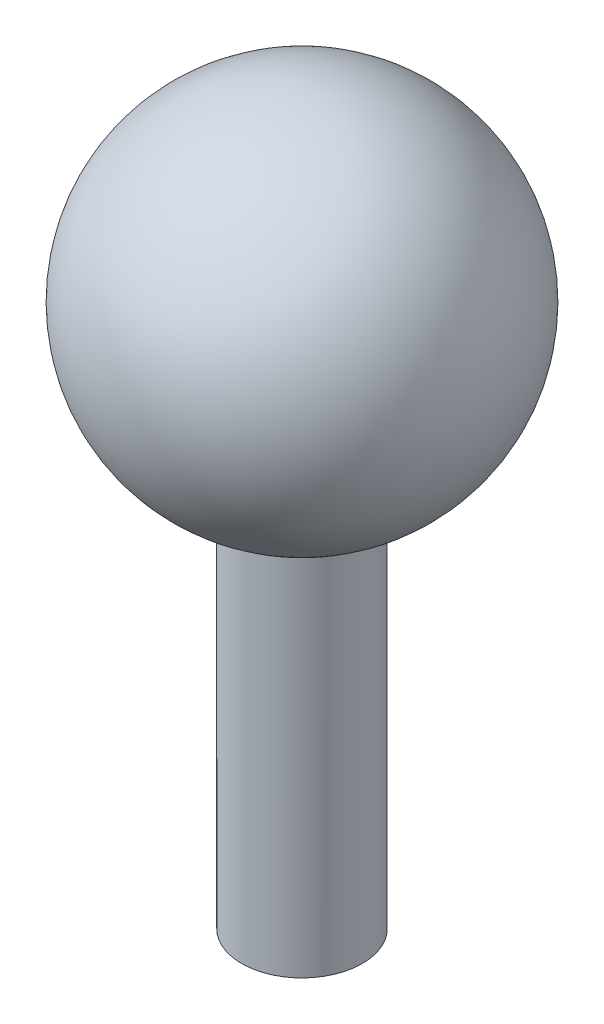
ISO-10303-21;
HEADER;
FILE_DESCRIPTION(('STEP AP214'),'2;1');
FILE_NAME('part.step','',(''),(''),'','','');
FILE_SCHEMA(('AUTOMOTIVE_DESIGN { 1 0 10303 214 1 1 1 1 }'));
ENDSEC;
DATA;
#1=APPLICATION_CONTEXT('core data for automotive mechanical design processes');
#2=APPLICATION_PROTOCOL_DEFINITION('international standard','automotive_design',2000,#1);
#3=PRODUCT_CONTEXT('',#1,'mechanical');
#4=PRODUCT('Part','Part','',(#3));
#5=PRODUCT_RELATED_PRODUCT_CATEGORY('part','',(#4));
#6=PRODUCT_DEFINITION_FORMATION('','',#4);
#7=PRODUCT_DEFINITION_CONTEXT('part definition',#1,'design');
#8=PRODUCT_DEFINITION('design','',#6,#7);
#9=PRODUCT_DEFINITION_SHAPE('','',#8);
#10=(LENGTH_UNIT() NAMED_UNIT(*) SI_UNIT(.MILLI.,.METRE.));
#11=(NAMED_UNIT(*) PLANE_ANGLE_UNIT() SI_UNIT($,.RADIAN.));
#12=(NAMED_UNIT(*) SI_UNIT($,.STERADIAN.) SOLID_ANGLE_UNIT());
#13=UNCERTAINTY_MEASURE_WITH_UNIT(LENGTH_MEASURE(1.E-05),#10,'distance_accuracy_value','');
#14=(GEOMETRIC_REPRESENTATION_CONTEXT(3) GLOBAL_UNCERTAINTY_ASSIGNED_CONTEXT((#13)) GLOBAL_UNIT_ASSIGNED_CONTEXT((#10,
#11,#12)) REPRESENTATION_CONTEXT('',''));
#15=CARTESIAN_POINT('',(0.,0.,0.));
#16=DIRECTION('',(0.,0.,1.));
#17=DIRECTION('',(1.,0.,0.));
#18=AXIS2_PLACEMENT_3D('',#15,#16,#17);
#19=CARTESIAN_POINT('',(0.,45.,0.));
#20=DIRECTION('',(0.,-1.,0.));
#21=DIRECTION('',(1.,0.,0.));
#22=AXIS2_PLACEMENT_3D('',#19,#20,#21);
#23=SPHERICAL_SURFACE('',#22,15.);
#24=CARTESIAN_POINT('',(0.,30.857864376269,0.));
#25=DIRECTION('',(0.,-1.,0.));
#26=DIRECTION('',(0.,0.,-1.));
#27=AXIS2_PLACEMENT_3D('',#24,#25,#26);
#28=CIRCLE('',#27,5.);
#29=CARTESIAN_POINT('',(0.,30.857864376269,-5.));
#30=VERTEX_POINT('',#29);
#31=EDGE_CURVE('E10',#30,#30,#28,.T.);
#32=ORIENTED_EDGE('',*,*,#31,.F.);
#33=EDGE_LOOP('',(#32));
#34=FACE_BOUND('',#33,.T.);
#35=ADVANCED_FACE('F45',(#34),#23,.T.);
#36=CARTESIAN_POINT('',(0.,0.,0.));
#37=DIRECTION('',(0.,-1.,0.));
#38=DIRECTION('',(0.,0.,-1.));
#39=AXIS2_PLACEMENT_3D('',#36,#37,#38);
#40=CYLINDRICAL_SURFACE('',#39,5.);
#41=CARTESIAN_POINT('',(0.,0.,0.));
#42=DIRECTION('',(0.,-1.,0.));
#43=DIRECTION('',(0.,0.,-1.));
#44=AXIS2_PLACEMENT_3D('',#41,#42,#43);
#45=CIRCLE('',#44,5.);
#46=CARTESIAN_POINT('',(0.,0.,-5.));
#47=VERTEX_POINT('',#46);
#48=EDGE_CURVE('E51',#47,#47,#45,.T.);
#49=ORIENTED_EDGE('',*,*,#48,.F.);
#50=EDGE_LOOP('',(#49));
#51=FACE_BOUND('',#50,.T.);
#52=ORIENTED_EDGE('',*,*,#31,.T.);
#53=EDGE_LOOP('',(#52));
#54=FACE_BOUND('',#53,.T.);
#55=ADVANCED_FACE('F59',(#51,#54),#40,.T.);
#56=CARTESIAN_POINT('',(0.,0.,0.));
#57=DIRECTION('',(0.,1.,0.));
#58=DIRECTION('',(0.,0.,1.));
#59=AXIS2_PLACEMENT_3D('',#56,#57,#58);
#60=PLANE('',#59);
#61=ORIENTED_EDGE('',*,*,#48,.T.);
#62=EDGE_LOOP('',(#61));
#63=FACE_BOUND('',#62,.T.);
#64=ADVANCED_FACE('F57',(#63),#60,.F.);
#65=CLOSED_SHELL('',(#35,#55,#64));
#66=MANIFOLD_SOLID_BREP('B2',#65);
#67=ADVANCED_BREP_SHAPE_REPRESENTATION('',(#18,#66),#14);
#68=SHAPE_DEFINITION_REPRESENTATION(#9,#67);
ENDSEC;
END-ISO-10303-21;
